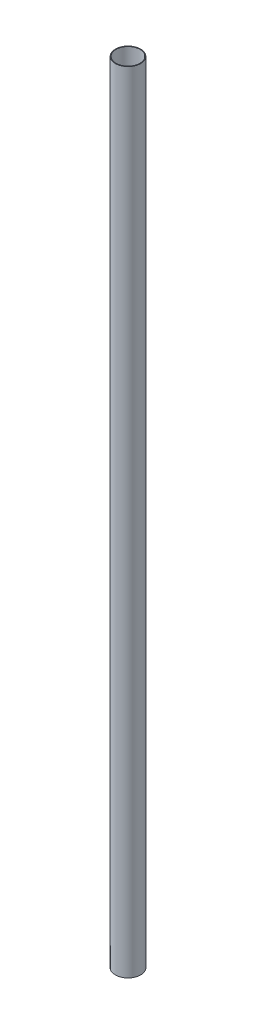
ISO-10303-21;
HEADER;
FILE_DESCRIPTION(('STEP AP214'),'2;1');
FILE_NAME('part.step','',(''),(''),'','','');
FILE_SCHEMA(('AUTOMOTIVE_DESIGN { 1 0 10303 214 1 1 1 1 }'));
ENDSEC;
DATA;
#1=APPLICATION_CONTEXT('core data for automotive mechanical design processes');
#2=APPLICATION_PROTOCOL_DEFINITION('international standard','automotive_design',2000,#1);
#3=PRODUCT_CONTEXT('',#1,'mechanical');
#4=PRODUCT('Part','Part','',(#3));
#5=PRODUCT_RELATED_PRODUCT_CATEGORY('part','',(#4));
#6=PRODUCT_DEFINITION_FORMATION('','',#4);
#7=PRODUCT_DEFINITION_CONTEXT('part definition',#1,'design');
#8=PRODUCT_DEFINITION('design','',#6,#7);
#9=PRODUCT_DEFINITION_SHAPE('','',#8);
#10=(LENGTH_UNIT() NAMED_UNIT(*) SI_UNIT(.MILLI.,.METRE.));
#11=(NAMED_UNIT(*) PLANE_ANGLE_UNIT() SI_UNIT($,.RADIAN.));
#12=(NAMED_UNIT(*) SI_UNIT($,.STERADIAN.) SOLID_ANGLE_UNIT());
#13=UNCERTAINTY_MEASURE_WITH_UNIT(LENGTH_MEASURE(1.E-05),#10,'distance_accuracy_value','');
#14=(GEOMETRIC_REPRESENTATION_CONTEXT(3) GLOBAL_UNCERTAINTY_ASSIGNED_CONTEXT((#13)) GLOBAL_UNIT_ASSIGNED_CONTEXT((#10,
#11,#12)) REPRESENTATION_CONTEXT('',''));
#15=CARTESIAN_POINT('',(0.,0.,0.));
#16=DIRECTION('',(0.,0.,1.));
#17=DIRECTION('',(1.,0.,0.));
#18=AXIS2_PLACEMENT_3D('',#15,#16,#17);
#19=CARTESIAN_POINT('',(0.,1270.,0.));
#20=DIRECTION('',(0.,1.,0.));
#21=DIRECTION('',(0.,0.,1.));
#22=AXIS2_PLACEMENT_3D('',#19,#20,#21);
#23=PLANE('',#22);
#24=CARTESIAN_POINT('',(0.,1270.,0.));
#25=DIRECTION('',(0.,1.,0.));
#26=DIRECTION('',(0.,0.,1.));
#27=AXIS2_PLACEMENT_3D('',#24,#25,#26);
#28=CIRCLE('',#27,20.32);
#29=CARTESIAN_POINT('',(0.,1270.,-20.32));
#30=VERTEX_POINT('',#29);
#31=EDGE_CURVE('E10',#30,#30,#28,.T.);
#32=ORIENTED_EDGE('',*,*,#31,.T.);
#33=EDGE_LOOP('',(#32));
#34=FACE_BOUND('',#33,.T.);
#35=CARTESIAN_POINT('',(0.,1270.,0.));
#36=DIRECTION('',(0.,1.,0.));
#37=DIRECTION('',(0.,0.,1.));
#38=AXIS2_PLACEMENT_3D('',#35,#36,#37);
#39=CIRCLE('',#38,19.304);
#40=CARTESIAN_POINT('',(0.,1270.,-19.304));
#41=VERTEX_POINT('',#40);
#42=EDGE_CURVE('E42',#41,#41,#39,.T.);
#43=ORIENTED_EDGE('',*,*,#42,.F.);
#44=EDGE_LOOP('',(#43));
#45=FACE_BOUND('',#44,.T.);
#46=ADVANCED_FACE('F31',(#34,#45),#23,.T.);
#47=CARTESIAN_POINT('',(0.,0.,0.));
#48=DIRECTION('',(0.,1.,0.));
#49=DIRECTION('',(0.,0.,1.));
#50=AXIS2_PLACEMENT_3D('',#47,#48,#49);
#51=PLANE('',#50);
#52=CARTESIAN_POINT('',(0.,0.,0.));
#53=DIRECTION('',(0.,1.,0.));
#54=DIRECTION('',(0.,0.,1.));
#55=AXIS2_PLACEMENT_3D('',#52,#53,#54);
#56=CIRCLE('',#55,20.32);
#57=CARTESIAN_POINT('',(0.,-2.22044604925031E-13,-20.32));
#58=VERTEX_POINT('',#57);
#59=EDGE_CURVE('E35',#58,#58,#56,.T.);
#60=ORIENTED_EDGE('',*,*,#59,.F.);
#61=EDGE_LOOP('',(#60));
#62=FACE_BOUND('',#61,.T.);
#63=CARTESIAN_POINT('',(0.,0.,0.));
#64=DIRECTION('',(0.,1.,0.));
#65=DIRECTION('',(0.,0.,1.));
#66=AXIS2_PLACEMENT_3D('',#63,#64,#65);
#67=CIRCLE('',#66,19.304);
#68=CARTESIAN_POINT('',(0.,-2.22044604925031E-13,-19.304));
#69=VERTEX_POINT('',#68);
#70=EDGE_CURVE('E44',#69,#69,#67,.T.);
#71=ORIENTED_EDGE('',*,*,#70,.T.);
#72=EDGE_LOOP('',(#71));
#73=FACE_BOUND('',#72,.T.);
#74=ADVANCED_FACE('F54',(#62,#73),#51,.F.);
#75=CARTESIAN_POINT('',(0.,1270.,0.));
#76=DIRECTION('',(0.,-1.,0.));
#77=DIRECTION('',(0.,0.,-1.));
#78=AXIS2_PLACEMENT_3D('',#75,#76,#77);
#79=CYLINDRICAL_SURFACE('',#78,20.32);
#80=CARTESIAN_POINT('',(0.,1270.,-20.32));
#81=CARTESIAN_POINT('',(0.,1256.77083333333,-20.32));
#82=CARTESIAN_POINT('',(0.,1243.54166666667,-20.32));
#83=CARTESIAN_POINT('',(0.,1217.08333333333,-20.32));
#84=CARTESIAN_POINT('',(0.,1203.85416666667,-20.32));
#85=CARTESIAN_POINT('',(0.,1177.39583333333,-20.32));
#86=CARTESIAN_POINT('',(0.,1164.16666666667,-20.32));
#87=CARTESIAN_POINT('',(0.,1137.70833333333,-20.32));
#88=CARTESIAN_POINT('',(0.,1124.47916666667,-20.32));
#89=CARTESIAN_POINT('',(0.,1098.02083333333,-20.32));
#90=CARTESIAN_POINT('',(0.,1084.79166666667,-20.32));
#91=CARTESIAN_POINT('',(0.,1058.33333333333,-20.32));
#92=CARTESIAN_POINT('',(0.,1045.10416666667,-20.32));
#93=CARTESIAN_POINT('',(0.,1018.64583333333,-20.32));
#94=CARTESIAN_POINT('',(0.,1005.41666666667,-20.32));
#95=CARTESIAN_POINT('',(0.,978.958333333333,-20.32));
#96=CARTESIAN_POINT('',(0.,965.729166666667,-20.32));
#97=CARTESIAN_POINT('',(0.,939.270833333333,-20.32));
#98=CARTESIAN_POINT('',(0.,926.041666666667,-20.32));
#99=CARTESIAN_POINT('',(0.,899.583333333333,-20.32));
#100=CARTESIAN_POINT('',(0.,886.354166666667,-20.32));
#101=CARTESIAN_POINT('',(0.,859.895833333333,-20.32));
#102=CARTESIAN_POINT('',(0.,846.666666666667,-20.32));
#103=CARTESIAN_POINT('',(0.,820.208333333333,-20.32));
#104=CARTESIAN_POINT('',(0.,806.979166666667,-20.32));
#105=CARTESIAN_POINT('',(0.,780.520833333333,-20.32));
#106=CARTESIAN_POINT('',(0.,767.291666666667,-20.32));
#107=CARTESIAN_POINT('',(0.,740.833333333333,-20.32));
#108=CARTESIAN_POINT('',(0.,727.604166666667,-20.32));
#109=CARTESIAN_POINT('',(0.,701.145833333333,-20.32));
#110=CARTESIAN_POINT('',(0.,687.916666666667,-20.32));
#111=CARTESIAN_POINT('',(0.,661.458333333333,-20.32));
#112=CARTESIAN_POINT('',(0.,648.229166666667,-20.32));
#113=CARTESIAN_POINT('',(0.,621.770833333333,-20.32));
#114=CARTESIAN_POINT('',(0.,608.541666666667,-20.32));
#115=CARTESIAN_POINT('',(0.,582.083333333333,-20.32));
#116=CARTESIAN_POINT('',(0.,568.854166666667,-20.32));
#117=CARTESIAN_POINT('',(0.,542.395833333333,-20.32));
#118=CARTESIAN_POINT('',(0.,529.166666666667,-20.32));
#119=CARTESIAN_POINT('',(0.,502.708333333333,-20.32));
#120=CARTESIAN_POINT('',(0.,489.479166666667,-20.32));
#121=CARTESIAN_POINT('',(0.,463.020833333333,-20.32));
#122=CARTESIAN_POINT('',(0.,449.791666666667,-20.32));
#123=CARTESIAN_POINT('',(0.,423.333333333333,-20.32));
#124=CARTESIAN_POINT('',(0.,410.104166666667,-20.32));
#125=CARTESIAN_POINT('',(0.,383.645833333333,-20.32));
#126=CARTESIAN_POINT('',(0.,370.416666666667,-20.32));
#127=CARTESIAN_POINT('',(0.,343.958333333333,-20.32));
#128=CARTESIAN_POINT('',(0.,330.729166666667,-20.32));
#129=CARTESIAN_POINT('',(0.,304.270833333333,-20.32));
#130=CARTESIAN_POINT('',(0.,291.041666666666,-20.32));
#131=CARTESIAN_POINT('',(0.,264.583333333333,-20.32));
#132=CARTESIAN_POINT('',(0.,251.354166666667,-20.32));
#133=CARTESIAN_POINT('',(0.,224.895833333333,-20.32));
#134=CARTESIAN_POINT('',(0.,211.666666666667,-20.32));
#135=CARTESIAN_POINT('',(0.,185.208333333333,-20.32));
#136=CARTESIAN_POINT('',(0.,171.979166666666,-20.32));
#137=CARTESIAN_POINT('',(0.,145.520833333333,-20.32));
#138=CARTESIAN_POINT('',(0.,132.291666666666,-20.32));
#139=CARTESIAN_POINT('',(0.,105.833333333333,-20.32));
#140=CARTESIAN_POINT('',(0.,92.6041666666664,-20.32));
#141=CARTESIAN_POINT('',(0.,66.1458333333331,-20.32));
#142=CARTESIAN_POINT('',(0.,52.9166666666665,-20.32));
#143=CARTESIAN_POINT('',(0.,26.4583333333332,-20.32));
#144=CARTESIAN_POINT('',(0.,13.2291666666665,-20.32));
#145=CARTESIAN_POINT('',(0.,-2.22044604925031E-13,-20.32));
#146=B_SPLINE_CURVE_WITH_KNOTS('',3,(#80,#81,#82,#83,#84,#85,#86,#87,#88,#89,#90,#91,#92,#93,
#94,#95,#96,#97,#98,#99,#100,#101,#102,#103,#104,#105,#106,#107,#108,#109,#110,#111,#112,#113,
#114,#115,#116,#117,#118,#119,#120,#121,#122,#123,#124,#125,#126,#127,#128,#129,#130,#131,#132,
#133,#134,#135,#136,#137,#138,#139,#140,#141,#142,#143,#144,#145),.UNSPECIFIED.,.F.,.F.,(4,2,2,
2,2,2,2,2,2,2,2,2,2,2,2,2,2,2,2,2,2,2,2,2,2,2,2,2,2,2,2,2,4),(0.,39.6874999999999,79.375,
119.0625,158.75,198.4375,238.125,277.8125,317.5,357.1875,396.875,436.5625,476.25,515.9375,
555.625,595.3125,635.,674.6875,714.375,754.0625,793.75,833.4375,873.125,912.8125,952.5,992.1875,
1031.875,1071.5625,1111.25,1150.9375,1190.625,1230.3125,1270.),.UNSPECIFIED.);
#147=EDGE_CURVE('BSEAM33',#30,#58,#146,.T.);
#148=ORIENTED_EDGE('',*,*,#31,.F.);
#149=ORIENTED_EDGE('',*,*,#59,.T.);
#150=ORIENTED_EDGE('',*,*,#147,.T.);
#151=ORIENTED_EDGE('',*,*,#147,.F.);
#152=EDGE_LOOP('',(#148,#150,#149,#151));
#153=FACE_BOUND('',#152,.T.);
#154=ADVANCED_FACE('F33',(#153),#79,.T.);
#155=CARTESIAN_POINT('',(0.,1270.,0.));
#156=DIRECTION('',(0.,-1.,0.));
#157=DIRECTION('',(0.,0.,-1.));
#158=AXIS2_PLACEMENT_3D('',#155,#156,#157);
#159=CYLINDRICAL_SURFACE('',#158,19.304);
#160=CARTESIAN_POINT('',(0.,1270.,-19.304));
#161=CARTESIAN_POINT('',(0.,1256.77083333333,-19.304));
#162=CARTESIAN_POINT('',(0.,1243.54166666667,-19.304));
#163=CARTESIAN_POINT('',(0.,1217.08333333333,-19.304));
#164=CARTESIAN_POINT('',(0.,1203.85416666667,-19.304));
#165=CARTESIAN_POINT('',(0.,1177.39583333333,-19.304));
#166=CARTESIAN_POINT('',(0.,1164.16666666667,-19.304));
#167=CARTESIAN_POINT('',(0.,1137.70833333333,-19.304));
#168=CARTESIAN_POINT('',(0.,1124.47916666667,-19.304));
#169=CARTESIAN_POINT('',(0.,1098.02083333333,-19.304));
#170=CARTESIAN_POINT('',(0.,1084.79166666667,-19.304));
#171=CARTESIAN_POINT('',(0.,1058.33333333333,-19.304));
#172=CARTESIAN_POINT('',(0.,1045.10416666667,-19.304));
#173=CARTESIAN_POINT('',(0.,1018.64583333333,-19.304));
#174=CARTESIAN_POINT('',(0.,1005.41666666667,-19.304));
#175=CARTESIAN_POINT('',(0.,978.958333333333,-19.304));
#176=CARTESIAN_POINT('',(0.,965.729166666667,-19.304));
#177=CARTESIAN_POINT('',(0.,939.270833333333,-19.304));
#178=CARTESIAN_POINT('',(0.,926.041666666667,-19.304));
#179=CARTESIAN_POINT('',(0.,899.583333333333,-19.304));
#180=CARTESIAN_POINT('',(0.,886.354166666666,-19.304));
#181=CARTESIAN_POINT('',(0.,859.895833333333,-19.304));
#182=CARTESIAN_POINT('',(0.,846.666666666666,-19.304));
#183=CARTESIAN_POINT('',(0.,820.208333333333,-19.304));
#184=CARTESIAN_POINT('',(0.,806.979166666667,-19.304));
#185=CARTESIAN_POINT('',(0.,780.520833333333,-19.304));
#186=CARTESIAN_POINT('',(0.,767.291666666667,-19.304));
#187=CARTESIAN_POINT('',(0.,740.833333333333,-19.304));
#188=CARTESIAN_POINT('',(0.,727.604166666667,-19.304));
#189=CARTESIAN_POINT('',(0.,701.145833333333,-19.304));
#190=CARTESIAN_POINT('',(0.,687.916666666666,-19.304));
#191=CARTESIAN_POINT('',(0.,661.458333333333,-19.304));
#192=CARTESIAN_POINT('',(0.,648.229166666666,-19.304));
#193=CARTESIAN_POINT('',(0.,621.770833333333,-19.304));
#194=CARTESIAN_POINT('',(0.,608.541666666666,-19.304));
#195=CARTESIAN_POINT('',(0.,582.083333333333,-19.304));
#196=CARTESIAN_POINT('',(0.,568.854166666666,-19.304));
#197=CARTESIAN_POINT('',(0.,542.395833333333,-19.304));
#198=CARTESIAN_POINT('',(0.,529.166666666666,-19.304));
#199=CARTESIAN_POINT('',(0.,502.708333333333,-19.304));
#200=CARTESIAN_POINT('',(0.,489.479166666666,-19.304));
#201=CARTESIAN_POINT('',(0.,463.020833333333,-19.304));
#202=CARTESIAN_POINT('',(0.,449.791666666666,-19.304));
#203=CARTESIAN_POINT('',(0.,423.333333333333,-19.304));
#204=CARTESIAN_POINT('',(0.,410.104166666666,-19.304));
#205=CARTESIAN_POINT('',(0.,383.645833333333,-19.304));
#206=CARTESIAN_POINT('',(0.,370.416666666666,-19.304));
#207=CARTESIAN_POINT('',(0.,343.958333333333,-19.304));
#208=CARTESIAN_POINT('',(0.,330.729166666666,-19.304));
#209=CARTESIAN_POINT('',(0.,304.270833333333,-19.304));
#210=CARTESIAN_POINT('',(0.,291.041666666666,-19.304));
#211=CARTESIAN_POINT('',(0.,264.583333333333,-19.304));
#212=CARTESIAN_POINT('',(0.,251.354166666666,-19.304));
#213=CARTESIAN_POINT('',(0.,224.895833333333,-19.304));
#214=CARTESIAN_POINT('',(0.,211.666666666667,-19.304));
#215=CARTESIAN_POINT('',(0.,185.208333333333,-19.304));
#216=CARTESIAN_POINT('',(0.,171.979166666666,-19.304));
#217=CARTESIAN_POINT('',(0.,145.520833333333,-19.304));
#218=CARTESIAN_POINT('',(0.,132.291666666666,-19.304));
#219=CARTESIAN_POINT('',(0.,105.833333333333,-19.304));
#220=CARTESIAN_POINT('',(0.,92.6041666666664,-19.304));
#221=CARTESIAN_POINT('',(0.,66.1458333333331,-19.304));
#222=CARTESIAN_POINT('',(0.,52.9166666666665,-19.304));
#223=CARTESIAN_POINT('',(0.,26.4583333333332,-19.304));
#224=CARTESIAN_POINT('',(0.,13.2291666666665,-19.304));
#225=CARTESIAN_POINT('',(0.,-2.22044604925031E-13,-19.304));
#226=B_SPLINE_CURVE_WITH_KNOTS('',3,(#160,#161,#162,#163,#164,#165,#166,#167,#168,#169,#170,
#171,#172,#173,#174,#175,#176,#177,#178,#179,#180,#181,#182,#183,#184,#185,#186,#187,#188,#189,
#190,#191,#192,#193,#194,#195,#196,#197,#198,#199,#200,#201,#202,#203,#204,#205,#206,#207,#208,
#209,#210,#211,#212,#213,#214,#215,#216,#217,#218,#219,#220,#221,#222,#223,#224,#225),
.UNSPECIFIED.,.F.,.F.,(4,2,2,2,2,2,2,2,2,2,2,2,2,2,2,2,2,2,2,2,2,2,2,2,2,2,2,2,2,2,2,2,4),(0.,
39.6875000000001,79.3750000000002,119.0625,158.75,198.4375,238.125,277.8125,317.5,357.1875,
396.875,436.5625,476.25,515.9375,555.625,595.3125,635.,674.6875,714.375,754.0625,793.75,
833.4375,873.125,912.8125,952.5,992.1875,1031.875,1071.5625,1111.25,1150.9375,1190.625,
1230.3125,1270.),.UNSPECIFIED.);
#227=EDGE_CURVE('BSEAM50',#41,#69,#226,.T.);
#228=ORIENTED_EDGE('',*,*,#42,.T.);
#229=ORIENTED_EDGE('',*,*,#70,.F.);
#230=ORIENTED_EDGE('',*,*,#227,.T.);
#231=ORIENTED_EDGE('',*,*,#227,.F.);
#232=EDGE_LOOP('',(#228,#230,#229,#231));
#233=FACE_BOUND('',#232,.T.);
#234=ADVANCED_FACE('F50',(#233),#159,.F.);
#235=CLOSED_SHELL('',(#46,#74,#154,#234));
#236=MANIFOLD_SOLID_BREP('B2',#235);
#237=ADVANCED_BREP_SHAPE_REPRESENTATION('',(#18,#236),#14);
#238=SHAPE_DEFINITION_REPRESENTATION(#9,#237);
ENDSEC;
END-ISO-10303-21;
